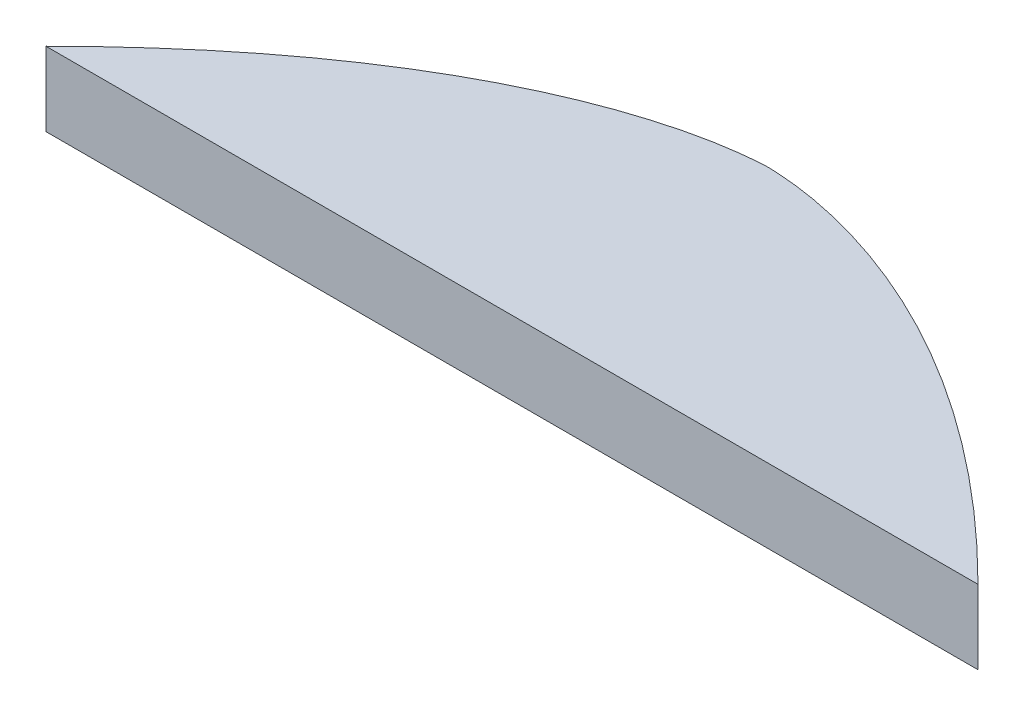
ISO-10303-21;
HEADER;
FILE_DESCRIPTION(('STEP AP214'),'2;1');
FILE_NAME('part.step','',(''),(''),'','','');
FILE_SCHEMA(('AUTOMOTIVE_DESIGN { 1 0 10303 214 1 1 1 1 }'));
ENDSEC;
DATA;
#1=APPLICATION_CONTEXT('core data for automotive mechanical design processes');
#2=APPLICATION_PROTOCOL_DEFINITION('international standard','automotive_design',2000,#1);
#3=PRODUCT_CONTEXT('',#1,'mechanical');
#4=PRODUCT('Part','Part','',(#3));
#5=PRODUCT_RELATED_PRODUCT_CATEGORY('part','',(#4));
#6=PRODUCT_DEFINITION_FORMATION('','',#4);
#7=PRODUCT_DEFINITION_CONTEXT('part definition',#1,'design');
#8=PRODUCT_DEFINITION('design','',#6,#7);
#9=PRODUCT_DEFINITION_SHAPE('','',#8);
#10=(LENGTH_UNIT() NAMED_UNIT(*) SI_UNIT(.MILLI.,.METRE.));
#11=(NAMED_UNIT(*) PLANE_ANGLE_UNIT() SI_UNIT($,.RADIAN.));
#12=(NAMED_UNIT(*) SI_UNIT($,.STERADIAN.) SOLID_ANGLE_UNIT());
#13=UNCERTAINTY_MEASURE_WITH_UNIT(LENGTH_MEASURE(1.E-05),#10,'distance_accuracy_value','');
#14=(GEOMETRIC_REPRESENTATION_CONTEXT(3) GLOBAL_UNCERTAINTY_ASSIGNED_CONTEXT((#13)) GLOBAL_UNIT_ASSIGNED_CONTEXT((#10,
#11,#12)) REPRESENTATION_CONTEXT('',''));
#15=CARTESIAN_POINT('',(0.,0.,0.));
#16=DIRECTION('',(0.,0.,1.));
#17=DIRECTION('',(1.,0.,0.));
#18=AXIS2_PLACEMENT_3D('',#15,#16,#17);
#19=CARTESIAN_POINT('',(0.,6.35,0.));
#20=DIRECTION('',(0.,0.,-1.));
#21=DIRECTION('',(-1.,0.,0.));
#22=AXIS2_PLACEMENT_3D('',#19,#20,#21);
#23=PLANE('',#22);
#24=DIRECTION('',(1.,0.,0.));
#25=VECTOR('',#24,1.);
#26=CARTESIAN_POINT('',(0.,0.,0.));
#27=LINE('',#26,#25);
#28=CARTESIAN_POINT('',(-40.,0.,0.));
#29=VERTEX_POINT('',#28);
#30=CARTESIAN_POINT('',(40.,0.,0.));
#31=VERTEX_POINT('',#30);
#32=EDGE_CURVE('E55',#29,#31,#27,.T.);
#33=ORIENTED_EDGE('',*,*,#32,.T.);
#34=DIRECTION('',(0.,-1.,0.));
#35=VECTOR('',#34,1.);
#36=CARTESIAN_POINT('',(40.,6.35,0.));
#37=LINE('',#36,#35);
#38=CARTESIAN_POINT('',(40.,6.35,0.));
#39=VERTEX_POINT('',#38);
#40=EDGE_CURVE('E11',#39,#31,#37,.T.);
#41=ORIENTED_EDGE('',*,*,#40,.F.);
#42=DIRECTION('',(1.,0.,0.));
#43=VECTOR('',#42,1.);
#44=CARTESIAN_POINT('',(0.,6.35,0.));
#45=LINE('',#44,#43);
#46=CARTESIAN_POINT('',(-40.,6.35,0.));
#47=VERTEX_POINT('',#46);
#48=EDGE_CURVE('E65',#47,#39,#45,.T.);
#49=ORIENTED_EDGE('',*,*,#48,.F.);
#50=DIRECTION('',(0.,-1.,0.));
#51=VECTOR('',#50,1.);
#52=CARTESIAN_POINT('',(-40.,6.35,0.));
#53=LINE('',#52,#51);
#54=EDGE_CURVE('E39',#47,#29,#53,.T.);
#55=ORIENTED_EDGE('',*,*,#54,.T.);
#56=EDGE_LOOP('',(#33,#41,#49,#55));
#57=FACE_BOUND('',#56,.T.);
#58=ADVANCED_FACE('F31',(#57),#23,.F.);
#59=CARTESIAN_POINT('',(40.0000000000001,6.35,0.));
#60=CARTESIAN_POINT('',(18.7867965644021,6.35,-21.2132034355977));
#61=CARTESIAN_POINT('',(-0.916771007397694,6.35,-22.0269974756309));
#62=CARTESIAN_POINT('',(0.966290132275796,6.35,-21.9831280603072));
#63=CARTESIAN_POINT('',(-18.7867965644036,6.35,-21.2132034355965));
#64=CARTESIAN_POINT('',(-40.,6.35,0.));
#65=B_SPLINE_CURVE_WITH_KNOTS('',3,(#59,#60,#61,#62,#63,#64),.UNSPECIFIED.,.F.,.F.,(4,1,1,4),
(0.,0.220067001749506,0.272926806326669,0.52859804577163),.UNSPECIFIED.);
#66=DIRECTION('',(0.,-1.,0.));
#67=VECTOR('',#66,1.);
#68=SURFACE_OF_LINEAR_EXTRUSION('',#65,#67);
#69=CARTESIAN_POINT('',(40.0000000000001,0.,0.));
#70=CARTESIAN_POINT('',(18.7867965644021,0.,-21.2132034355977));
#71=CARTESIAN_POINT('',(-0.916771007397694,0.,-22.0269974756309));
#72=CARTESIAN_POINT('',(0.966290132275796,0.,-21.9831280603072));
#73=CARTESIAN_POINT('',(-18.7867965644036,0.,-21.2132034355965));
#74=CARTESIAN_POINT('',(-40.,0.,0.));
#75=B_SPLINE_CURVE_WITH_KNOTS('',3,(#69,#70,#71,#72,#73,#74),.UNSPECIFIED.,.F.,.F.,(4,1,1,4),
(0.,0.220067001749506,0.272926806326669,0.52859804577163),.UNSPECIFIED.);
#76=EDGE_CURVE('E60',#31,#29,#75,.T.);
#77=ORIENTED_EDGE('',*,*,#76,.T.);
#78=ORIENTED_EDGE('',*,*,#54,.F.);
#79=EDGE_CURVE('E46',#39,#47,#65,.T.);
#80=ORIENTED_EDGE('',*,*,#79,.F.);
#81=ORIENTED_EDGE('',*,*,#40,.T.);
#82=EDGE_LOOP('',(#77,#78,#80,#81));
#83=FACE_BOUND('',#82,.T.);
#84=ADVANCED_FACE('F63',(#83),#68,.F.);
#85=CARTESIAN_POINT('',(-0.203656045402944,6.35,-21.9891704012627));
#86=DIRECTION('',(0.,1.,0.));
#87=DIRECTION('',(0.,0.,1.));
#88=AXIS2_PLACEMENT_3D('',#85,#86,#87);
#89=PLANE('',#88);
#90=ORIENTED_EDGE('',*,*,#48,.T.);
#91=ORIENTED_EDGE('',*,*,#79,.T.);
#92=EDGE_LOOP('',(#90,#91));
#93=FACE_BOUND('',#92,.T.);
#94=ADVANCED_FACE('F82',(#93),#89,.T.);
#95=CARTESIAN_POINT('',(-0.203656045402944,0.,-21.9891704012627));
#96=DIRECTION('',(0.,1.,0.));
#97=DIRECTION('',(0.,0.,1.));
#98=AXIS2_PLACEMENT_3D('',#95,#96,#97);
#99=PLANE('',#98);
#100=ORIENTED_EDGE('',*,*,#32,.F.);
#101=ORIENTED_EDGE('',*,*,#76,.F.);
#102=EDGE_LOOP('',(#100,#101));
#103=FACE_BOUND('',#102,.T.);
#104=ADVANCED_FACE('F59',(#103),#99,.F.);
#105=CLOSED_SHELL('',(#58,#84,#94,#104));
#106=MANIFOLD_SOLID_BREP('B2',#105);
#107=ADVANCED_BREP_SHAPE_REPRESENTATION('',(#18,#106),#14);
#108=SHAPE_DEFINITION_REPRESENTATION(#9,#107);
ENDSEC;
END-ISO-10303-21;
